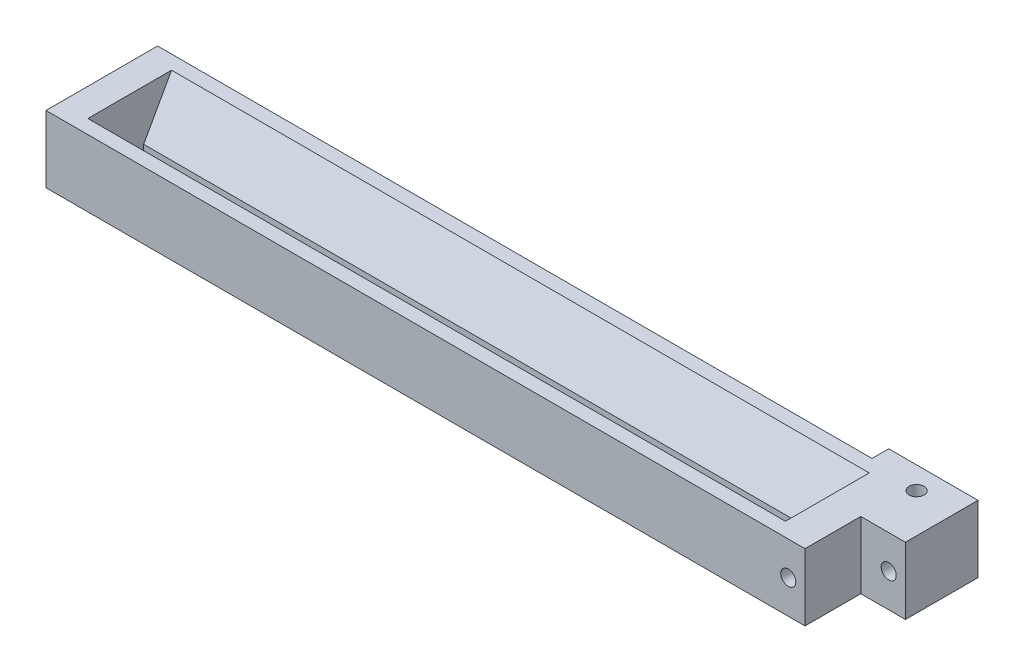
ISO-10303-21;
HEADER;
FILE_DESCRIPTION(('STEP AP214'),'2;1');
FILE_NAME('part.step','',(''),(''),'','','');
FILE_SCHEMA(('AUTOMOTIVE_DESIGN { 1 0 10303 214 1 1 1 1 }'));
ENDSEC;
DATA;
#1=APPLICATION_CONTEXT('core data for automotive mechanical design processes');
#2=APPLICATION_PROTOCOL_DEFINITION('international standard','automotive_design',2000,#1);
#3=PRODUCT_CONTEXT('',#1,'mechanical');
#4=PRODUCT('Part','Part','',(#3));
#5=PRODUCT_RELATED_PRODUCT_CATEGORY('part','',(#4));
#6=PRODUCT_DEFINITION_FORMATION('','',#4);
#7=PRODUCT_DEFINITION_CONTEXT('part definition',#1,'design');
#8=PRODUCT_DEFINITION('design','',#6,#7);
#9=PRODUCT_DEFINITION_SHAPE('','',#8);
#10=(LENGTH_UNIT() NAMED_UNIT(*) SI_UNIT(.MILLI.,.METRE.));
#11=(NAMED_UNIT(*) PLANE_ANGLE_UNIT() SI_UNIT($,.RADIAN.));
#12=(NAMED_UNIT(*) SI_UNIT($,.STERADIAN.) SOLID_ANGLE_UNIT());
#13=UNCERTAINTY_MEASURE_WITH_UNIT(LENGTH_MEASURE(1.E-05),#10,'distance_accuracy_value','');
#14=(GEOMETRIC_REPRESENTATION_CONTEXT(3) GLOBAL_UNCERTAINTY_ASSIGNED_CONTEXT((#13)) GLOBAL_UNIT_ASSIGNED_CONTEXT((#10,
#11,#12)) REPRESENTATION_CONTEXT('',''));
#15=CARTESIAN_POINT('',(0.,0.,0.));
#16=DIRECTION('',(0.,0.,1.));
#17=DIRECTION('',(1.,0.,0.));
#18=AXIS2_PLACEMENT_3D('',#15,#16,#17);
#19=CARTESIAN_POINT('',(0.,12.,0.));
#20=DIRECTION('',(0.,1.,0.));
#21=DIRECTION('',(0.,0.,1.));
#22=AXIS2_PLACEMENT_3D('',#19,#20,#21);
#23=PLANE('',#22);
#24=DIRECTION('',(1.,0.,0.));
#25=VECTOR('',#24,1.);
#26=CARTESIAN_POINT('',(-67.5,12.,10.));
#27=LINE('',#26,#25);
#28=CARTESIAN_POINT('',(-67.5,12.,10.));
#29=VERTEX_POINT('',#28);
#30=CARTESIAN_POINT('',(68.5,12.,10.));
#31=VERTEX_POINT('',#30);
#32=EDGE_CURVE('E137',#29,#31,#27,.T.);
#33=ORIENTED_EDGE('',*,*,#32,.T.);
#34=DIRECTION('',(0.,0.,-1.));
#35=VECTOR('',#34,1.);
#36=CARTESIAN_POINT('',(68.5,12.,10.));
#37=LINE('',#36,#35);
#38=CARTESIAN_POINT('',(68.5,12.,0.));
#39=VERTEX_POINT('',#38);
#40=EDGE_CURVE('E142',#31,#39,#37,.T.);
#41=ORIENTED_EDGE('',*,*,#40,.T.);
#42=DIRECTION('',(1.,0.,0.));
#43=VECTOR('',#42,1.);
#44=CARTESIAN_POINT('',(68.5,12.,0.));
#45=LINE('',#44,#43);
#46=CARTESIAN_POINT('',(76.5,12.,0.));
#47=VERTEX_POINT('',#46);
#48=EDGE_CURVE('E163',#39,#47,#45,.T.);
#49=ORIENTED_EDGE('',*,*,#48,.T.);
#50=DIRECTION('',(0.,0.,-1.));
#51=VECTOR('',#50,1.);
#52=CARTESIAN_POINT('',(76.5,12.,0.));
#53=LINE('',#52,#51);
#54=CARTESIAN_POINT('',(76.5,12.,-13.));
#55=VERTEX_POINT('',#54);
#56=EDGE_CURVE('E166',#47,#55,#53,.T.);
#57=ORIENTED_EDGE('',*,*,#56,.T.);
#58=DIRECTION('',(-1.,0.,0.));
#59=VECTOR('',#58,1.);
#60=CARTESIAN_POINT('',(60.5,12.,-13.));
#61=LINE('',#60,#59);
#62=CARTESIAN_POINT('',(60.5,12.,-13.));
#63=VERTEX_POINT('',#62);
#64=EDGE_CURVE('E175',#55,#63,#61,.T.);
#65=ORIENTED_EDGE('',*,*,#64,.T.);
#66=DIRECTION('',(0.,0.,1.));
#67=VECTOR('',#66,1.);
#68=CARTESIAN_POINT('',(60.5,12.,-10.));
#69=LINE('',#68,#67);
#70=CARTESIAN_POINT('',(60.5,12.,-10.));
#71=VERTEX_POINT('',#70);
#72=EDGE_CURVE('E164',#63,#71,#69,.T.);
#73=ORIENTED_EDGE('',*,*,#72,.T.);
#74=DIRECTION('',(-1.,0.,0.));
#75=VECTOR('',#74,1.);
#76=CARTESIAN_POINT('',(-67.5,12.,-10.));
#77=LINE('',#76,#75);
#78=CARTESIAN_POINT('',(-67.5,12.,-10.));
#79=VERTEX_POINT('',#78);
#80=EDGE_CURVE('E49',#71,#79,#77,.T.);
#81=ORIENTED_EDGE('',*,*,#80,.T.);
#82=DIRECTION('',(0.,0.,1.));
#83=VECTOR('',#82,1.);
#84=CARTESIAN_POINT('',(-67.5,12.,10.));
#85=LINE('',#84,#83);
#86=EDGE_CURVE('E144',#79,#29,#85,.T.);
#87=ORIENTED_EDGE('',*,*,#86,.T.);
#88=EDGE_LOOP('',(#33,#41,#49,#57,#65,#73,#81,#87));
#89=FACE_BOUND('',#88,.T.);
#90=DIRECTION('',(1.,0.,0.));
#91=VECTOR('',#90,1.);
#92=CARTESIAN_POINT('',(-62.5,12.,7.5));
#93=LINE('',#92,#91);
#94=CARTESIAN_POINT('',(-62.5,12.,7.5));
#95=VERTEX_POINT('',#94);
#96=CARTESIAN_POINT('',(62.5,12.,7.5));
#97=VERTEX_POINT('',#96);
#98=EDGE_CURVE('E211',#95,#97,#93,.T.);
#99=ORIENTED_EDGE('',*,*,#98,.F.);
#100=DIRECTION('',(0.,0.,1.));
#101=VECTOR('',#100,1.);
#102=CARTESIAN_POINT('',(-62.5,12.,-7.5));
#103=LINE('',#102,#101);
#104=CARTESIAN_POINT('',(-62.5,12.,-7.5));
#105=VERTEX_POINT('',#104);
#106=EDGE_CURVE('E192',#105,#95,#103,.T.);
#107=ORIENTED_EDGE('',*,*,#106,.F.);
#108=DIRECTION('',(1.,0.,0.));
#109=VECTOR('',#108,1.);
#110=CARTESIAN_POINT('',(-62.5,12.,-7.5));
#111=LINE('',#110,#109);
#112=CARTESIAN_POINT('',(62.5,12.,-7.5));
#113=VERTEX_POINT('',#112);
#114=EDGE_CURVE('E226',#105,#113,#111,.T.);
#115=ORIENTED_EDGE('',*,*,#114,.T.);
#116=DIRECTION('',(0.,0.,1.));
#117=VECTOR('',#116,1.);
#118=CARTESIAN_POINT('',(62.5,12.,-7.5));
#119=LINE('',#118,#117);
#120=EDGE_CURVE('E190',#113,#97,#119,.T.);
#121=ORIENTED_EDGE('',*,*,#120,.T.);
#122=EDGE_LOOP('',(#99,#107,#115,#121));
#123=FACE_BOUND('',#122,.T.);
#124=CARTESIAN_POINT('',(69.5,12.,-9.));
#125=DIRECTION('',(0.,1.,0.));
#126=DIRECTION('',(0.,0.,1.));
#127=AXIS2_PLACEMENT_3D('',#124,#125,#126);
#128=CIRCLE('',#127,1.35000000000001);
#129=CARTESIAN_POINT('',(69.5,12.,-7.65));
#130=VERTEX_POINT('',#129);
#131=EDGE_CURVE('E169',#130,#130,#128,.T.);
#132=ORIENTED_EDGE('',*,*,#131,.F.);
#133=EDGE_LOOP('',(#132));
#134=FACE_BOUND('',#133,.T.);
#135=ADVANCED_FACE('F34',(#89,#123,#134),#23,.T.);
#136=CARTESIAN_POINT('',(0.,0.,0.));
#137=DIRECTION('',(0.,1.,0.));
#138=DIRECTION('',(0.,0.,1.));
#139=AXIS2_PLACEMENT_3D('',#136,#137,#138);
#140=PLANE('',#139);
#141=DIRECTION('',(1.,0.,0.));
#142=VECTOR('',#141,1.);
#143=CARTESIAN_POINT('',(-67.5,0.,10.));
#144=LINE('',#143,#142);
#145=CARTESIAN_POINT('',(-67.5,0.,10.));
#146=VERTEX_POINT('',#145);
#147=CARTESIAN_POINT('',(68.5,0.,10.));
#148=VERTEX_POINT('',#147);
#149=EDGE_CURVE('E153',#146,#148,#144,.T.);
#150=ORIENTED_EDGE('',*,*,#149,.F.);
#151=DIRECTION('',(0.,0.,1.));
#152=VECTOR('',#151,1.);
#153=CARTESIAN_POINT('',(-67.5,0.,10.));
#154=LINE('',#153,#152);
#155=CARTESIAN_POINT('',(-67.5,0.,-10.));
#156=VERTEX_POINT('',#155);
#157=EDGE_CURVE('E148',#156,#146,#154,.T.);
#158=ORIENTED_EDGE('',*,*,#157,.F.);
#159=DIRECTION('',(-1.,0.,0.));
#160=VECTOR('',#159,1.);
#161=CARTESIAN_POINT('',(-67.5,0.,-10.));
#162=LINE('',#161,#160);
#163=CARTESIAN_POINT('',(60.5,0.,-10.));
#164=VERTEX_POINT('',#163);
#165=EDGE_CURVE('E243',#164,#156,#162,.T.);
#166=ORIENTED_EDGE('',*,*,#165,.F.);
#167=DIRECTION('',(0.,0.,-1.));
#168=VECTOR('',#167,1.);
#169=CARTESIAN_POINT('',(60.5,0.,-10.));
#170=LINE('',#169,#168);
#171=CARTESIAN_POINT('',(60.5,0.,-13.));
#172=VERTEX_POINT('',#171);
#173=EDGE_CURVE('E191',#164,#172,#170,.T.);
#174=ORIENTED_EDGE('',*,*,#173,.T.);
#175=DIRECTION('',(1.,0.,0.));
#176=VECTOR('',#175,1.);
#177=CARTESIAN_POINT('',(60.5,0.,-13.));
#178=LINE('',#177,#176);
#179=CARTESIAN_POINT('',(76.5,0.,-13.));
#180=VERTEX_POINT('',#179);
#181=EDGE_CURVE('E260',#172,#180,#178,.T.);
#182=ORIENTED_EDGE('',*,*,#181,.T.);
#183=DIRECTION('',(0.,0.,1.));
#184=VECTOR('',#183,1.);
#185=CARTESIAN_POINT('',(76.5,0.,0.));
#186=LINE('',#185,#184);
#187=CARTESIAN_POINT('',(76.5,0.,0.));
#188=VERTEX_POINT('',#187);
#189=EDGE_CURVE('E253',#180,#188,#186,.T.);
#190=ORIENTED_EDGE('',*,*,#189,.T.);
#191=DIRECTION('',(-1.,0.,0.));
#192=VECTOR('',#191,1.);
#193=CARTESIAN_POINT('',(68.5,0.,0.));
#194=LINE('',#193,#192);
#195=CARTESIAN_POINT('',(68.5,0.,0.));
#196=VERTEX_POINT('',#195);
#197=EDGE_CURVE('E251',#188,#196,#194,.T.);
#198=ORIENTED_EDGE('',*,*,#197,.T.);
#199=DIRECTION('',(0.,0.,1.));
#200=VECTOR('',#199,1.);
#201=CARTESIAN_POINT('',(68.5,0.,10.));
#202=LINE('',#201,#200);
#203=EDGE_CURVE('E180',#196,#148,#202,.T.);
#204=ORIENTED_EDGE('',*,*,#203,.T.);
#205=EDGE_LOOP('',(#150,#158,#166,#174,#182,#190,#198,#204));
#206=FACE_BOUND('',#205,.T.);
#207=DIRECTION('',(0.,0.,-1.));
#208=VECTOR('',#207,1.);
#209=CARTESIAN_POINT('',(-62.5,0.,2.5));
#210=LINE('',#209,#208);
#211=CARTESIAN_POINT('',(-62.5,0.,2.5));
#212=VERTEX_POINT('',#211);
#213=CARTESIAN_POINT('',(-62.5,0.,-2.5));
#214=VERTEX_POINT('',#213);
#215=EDGE_CURVE('E202',#212,#214,#210,.T.);
#216=ORIENTED_EDGE('',*,*,#215,.F.);
#217=DIRECTION('',(1.,0.,0.));
#218=VECTOR('',#217,1.);
#219=CARTESIAN_POINT('',(-62.5,0.,2.5));
#220=LINE('',#219,#218);
#221=CARTESIAN_POINT('',(62.5,0.,2.5));
#222=VERTEX_POINT('',#221);
#223=EDGE_CURVE('E234',#212,#222,#220,.T.);
#224=ORIENTED_EDGE('',*,*,#223,.T.);
#225=DIRECTION('',(0.,0.,-1.));
#226=VECTOR('',#225,1.);
#227=CARTESIAN_POINT('',(62.5,0.,2.5));
#228=LINE('',#227,#226);
#229=CARTESIAN_POINT('',(62.5,0.,-2.5));
#230=VERTEX_POINT('',#229);
#231=EDGE_CURVE('E218',#222,#230,#228,.T.);
#232=ORIENTED_EDGE('',*,*,#231,.T.);
#233=DIRECTION('',(1.,0.,0.));
#234=VECTOR('',#233,1.);
#235=CARTESIAN_POINT('',(-62.5,0.,-2.5));
#236=LINE('',#235,#234);
#237=EDGE_CURVE('E231',#214,#230,#236,.T.);
#238=ORIENTED_EDGE('',*,*,#237,.F.);
#239=EDGE_LOOP('',(#216,#224,#232,#238));
#240=FACE_BOUND('',#239,.T.);
#241=CARTESIAN_POINT('',(69.5,0.,-9.));
#242=DIRECTION('',(0.,1.,0.));
#243=DIRECTION('',(0.,0.,1.));
#244=AXIS2_PLACEMENT_3D('',#241,#242,#243);
#245=CIRCLE('',#244,1.35000000000001);
#246=CARTESIAN_POINT('',(69.5,0.,-7.65));
#247=VERTEX_POINT('',#246);
#248=EDGE_CURVE('E187',#247,#247,#245,.F.);
#249=ORIENTED_EDGE('',*,*,#248,.F.);
#250=EDGE_LOOP('',(#249));
#251=FACE_BOUND('',#250,.T.);
#252=ADVANCED_FACE('F248',(#206,#240,#251),#140,.F.);
#253=CARTESIAN_POINT('',(-67.5,12.,10.));
#254=DIRECTION('',(0.,0.,-1.));
#255=DIRECTION('',(-1.,0.,0.));
#256=AXIS2_PLACEMENT_3D('',#253,#254,#255);
#257=PLANE('',#256);
#258=CARTESIAN_POINT('',(65.5,6.,10.));
#259=DIRECTION('',(0.,0.,-1.));
#260=DIRECTION('',(-1.,0.,0.));
#261=AXIS2_PLACEMENT_3D('',#258,#259,#260);
#262=CIRCLE('',#261,1.35000000000001);
#263=CARTESIAN_POINT('',(64.15,6.,10.));
#264=VERTEX_POINT('',#263);
#265=EDGE_CURVE('E266',#264,#264,#262,.T.);
#266=ORIENTED_EDGE('',*,*,#265,.T.);
#267=EDGE_LOOP('',(#266));
#268=FACE_BOUND('',#267,.T.);
#269=ORIENTED_EDGE('',*,*,#149,.T.);
#270=DIRECTION('',(0.,1.,0.));
#271=VECTOR('',#270,1.);
#272=CARTESIAN_POINT('',(68.5,-28.0178514522438,10.));
#273=LINE('',#272,#271);
#274=EDGE_CURVE('E151',#148,#31,#273,.T.);
#275=ORIENTED_EDGE('',*,*,#274,.T.);
#276=ORIENTED_EDGE('',*,*,#32,.F.);
#277=DIRECTION('',(0.,-1.,0.));
#278=VECTOR('',#277,1.);
#279=CARTESIAN_POINT('',(-67.5,12.,10.));
#280=LINE('',#279,#278);
#281=EDGE_CURVE('E42',#29,#146,#280,.T.);
#282=ORIENTED_EDGE('',*,*,#281,.T.);
#283=EDGE_LOOP('',(#269,#275,#276,#282));
#284=FACE_BOUND('',#283,.T.);
#285=ADVANCED_FACE('F36',(#268,#284),#257,.F.);
#286=CARTESIAN_POINT('',(-67.5,12.,-10.));
#287=DIRECTION('',(0.,0.,1.));
#288=DIRECTION('',(1.,0.,0.));
#289=AXIS2_PLACEMENT_3D('',#286,#287,#288);
#290=PLANE('',#289);
#291=ORIENTED_EDGE('',*,*,#80,.F.);
#292=DIRECTION('',(0.,1.,0.));
#293=VECTOR('',#292,1.);
#294=CARTESIAN_POINT('',(60.5,-28.0178514522438,-10.));
#295=LINE('',#294,#293);
#296=EDGE_CURVE('E158',#164,#71,#295,.T.);
#297=ORIENTED_EDGE('',*,*,#296,.F.);
#298=ORIENTED_EDGE('',*,*,#165,.T.);
#299=DIRECTION('',(0.,-1.,0.));
#300=VECTOR('',#299,1.);
#301=CARTESIAN_POINT('',(-67.5,12.,-10.));
#302=LINE('',#301,#300);
#303=EDGE_CURVE('E11',#79,#156,#302,.T.);
#304=ORIENTED_EDGE('',*,*,#303,.F.);
#305=EDGE_LOOP('',(#291,#297,#298,#304));
#306=FACE_BOUND('',#305,.T.);
#307=ADVANCED_FACE('F325',(#306),#290,.F.);
#308=CARTESIAN_POINT('',(-67.5,12.,10.));
#309=DIRECTION('',(1.,0.,0.));
#310=DIRECTION('',(0.,0.,-1.));
#311=AXIS2_PLACEMENT_3D('',#308,#309,#310);
#312=PLANE('',#311);
#313=ORIENTED_EDGE('',*,*,#157,.T.);
#314=ORIENTED_EDGE('',*,*,#281,.F.);
#315=ORIENTED_EDGE('',*,*,#86,.F.);
#316=ORIENTED_EDGE('',*,*,#303,.T.);
#317=EDGE_LOOP('',(#313,#314,#315,#316));
#318=FACE_BOUND('',#317,.T.);
#319=ADVANCED_FACE('F322',(#318),#312,.F.);
#320=CARTESIAN_POINT('',(-62.5,12.,-7.5));
#321=DIRECTION('',(0.,-0.485642931178632,-0.874157276121538));
#322=DIRECTION('',(0.,0.874157276121538,-0.485642931178632));
#323=AXIS2_PLACEMENT_3D('',#320,#321,#322);
#324=PLANE('',#323);
#325=DIRECTION('',(0.,0.874157276121538,-0.485642931178632));
#326=VECTOR('',#325,1.);
#327=CARTESIAN_POINT('',(62.5,12.,-7.5));
#328=LINE('',#327,#326);
#329=CARTESIAN_POINT('',(62.5,3.,-2.5));
#330=VERTEX_POINT('',#329);
#331=EDGE_CURVE('E196',#330,#113,#328,.T.);
#332=ORIENTED_EDGE('',*,*,#331,.T.);
#333=ORIENTED_EDGE('',*,*,#114,.F.);
#334=DIRECTION('',(0.,0.874157276121538,-0.485642931178632));
#335=VECTOR('',#334,1.);
#336=CARTESIAN_POINT('',(-62.5,12.,-7.5));
#337=LINE('',#336,#335);
#338=CARTESIAN_POINT('',(-62.5,3.,-2.5));
#339=VERTEX_POINT('',#338);
#340=EDGE_CURVE('E208',#339,#105,#337,.T.);
#341=ORIENTED_EDGE('',*,*,#340,.F.);
#342=DIRECTION('',(1.,0.,0.));
#343=VECTOR('',#342,1.);
#344=CARTESIAN_POINT('',(-62.5,3.,-2.5));
#345=LINE('',#344,#343);
#346=EDGE_CURVE('E229',#339,#330,#345,.T.);
#347=ORIENTED_EDGE('',*,*,#346,.T.);
#348=EDGE_LOOP('',(#332,#333,#341,#347));
#349=FACE_BOUND('',#348,.T.);
#350=ADVANCED_FACE('F324',(#349),#324,.F.);
#351=CARTESIAN_POINT('',(-62.5,0.,-2.5));
#352=DIRECTION('',(0.,0.,-1.));
#353=DIRECTION('',(0.,1.,0.));
#354=AXIS2_PLACEMENT_3D('',#351,#352,#353);
#355=PLANE('',#354);
#356=DIRECTION('',(0.,1.,0.));
#357=VECTOR('',#356,1.);
#358=CARTESIAN_POINT('',(62.5,0.,-2.5));
#359=LINE('',#358,#357);
#360=EDGE_CURVE('E221',#230,#330,#359,.T.);
#361=ORIENTED_EDGE('',*,*,#360,.T.);
#362=ORIENTED_EDGE('',*,*,#346,.F.);
#363=DIRECTION('',(0.,1.,0.));
#364=VECTOR('',#363,1.);
#365=CARTESIAN_POINT('',(-62.5,0.,-2.5));
#366=LINE('',#365,#364);
#367=EDGE_CURVE('E205',#214,#339,#366,.T.);
#368=ORIENTED_EDGE('',*,*,#367,.F.);
#369=ORIENTED_EDGE('',*,*,#237,.T.);
#370=EDGE_LOOP('',(#361,#362,#368,#369));
#371=FACE_BOUND('',#370,.T.);
#372=ADVANCED_FACE('F421',(#371),#355,.F.);
#373=CARTESIAN_POINT('',(-62.5,3.,2.5));
#374=DIRECTION('',(0.,0.,1.));
#375=DIRECTION('',(0.,-1.,0.));
#376=AXIS2_PLACEMENT_3D('',#373,#374,#375);
#377=PLANE('',#376);
#378=DIRECTION('',(0.,-1.,0.));
#379=VECTOR('',#378,1.);
#380=CARTESIAN_POINT('',(62.5,3.,2.5));
#381=LINE('',#380,#379);
#382=CARTESIAN_POINT('',(62.5,3.,2.5));
#383=VERTEX_POINT('',#382);
#384=EDGE_CURVE('E215',#383,#222,#381,.T.);
#385=ORIENTED_EDGE('',*,*,#384,.T.);
#386=ORIENTED_EDGE('',*,*,#223,.F.);
#387=DIRECTION('',(0.,-1.,0.));
#388=VECTOR('',#387,1.);
#389=CARTESIAN_POINT('',(-62.5,3.,2.5));
#390=LINE('',#389,#388);
#391=CARTESIAN_POINT('',(-62.5,3.,2.5));
#392=VERTEX_POINT('',#391);
#393=EDGE_CURVE('E199',#392,#212,#390,.T.);
#394=ORIENTED_EDGE('',*,*,#393,.F.);
#395=DIRECTION('',(1.,0.,0.));
#396=VECTOR('',#395,1.);
#397=CARTESIAN_POINT('',(-62.5,3.,2.5));
#398=LINE('',#397,#396);
#399=EDGE_CURVE('E237',#392,#383,#398,.T.);
#400=ORIENTED_EDGE('',*,*,#399,.T.);
#401=EDGE_LOOP('',(#385,#386,#394,#400));
#402=FACE_BOUND('',#401,.T.);
#403=ADVANCED_FACE('F424',(#402),#377,.F.);
#404=CARTESIAN_POINT('',(-62.5,12.,7.5));
#405=DIRECTION('',(0.,-0.485642931178632,0.874157276121538));
#406=DIRECTION('',(0.,-0.874157276121538,-0.485642931178632));
#407=AXIS2_PLACEMENT_3D('',#404,#405,#406);
#408=PLANE('',#407);
#409=DIRECTION('',(0.,-0.874157276121538,-0.485642931178632));
#410=VECTOR('',#409,1.);
#411=CARTESIAN_POINT('',(62.5,12.,7.5));
#412=LINE('',#411,#410);
#413=EDGE_CURVE('E57',#97,#383,#412,.T.);
#414=ORIENTED_EDGE('',*,*,#413,.T.);
#415=ORIENTED_EDGE('',*,*,#399,.F.);
#416=DIRECTION('',(0.,-0.874157276121538,-0.485642931178632));
#417=VECTOR('',#416,1.);
#418=CARTESIAN_POINT('',(-62.5,12.,7.5));
#419=LINE('',#418,#417);
#420=EDGE_CURVE('E195',#95,#392,#419,.T.);
#421=ORIENTED_EDGE('',*,*,#420,.F.);
#422=ORIENTED_EDGE('',*,*,#98,.T.);
#423=EDGE_LOOP('',(#414,#415,#421,#422));
#424=FACE_BOUND('',#423,.T.);
#425=ADVANCED_FACE('F319',(#424),#408,.F.);
#426=CARTESIAN_POINT('',(-62.5,0.,0.));
#427=DIRECTION('',(1.,0.,0.));
#428=DIRECTION('',(0.,0.,-1.));
#429=AXIS2_PLACEMENT_3D('',#426,#427,#428);
#430=PLANE('',#429);
#431=ORIENTED_EDGE('',*,*,#106,.T.);
#432=ORIENTED_EDGE('',*,*,#420,.T.);
#433=ORIENTED_EDGE('',*,*,#393,.T.);
#434=ORIENTED_EDGE('',*,*,#215,.T.);
#435=ORIENTED_EDGE('',*,*,#367,.T.);
#436=ORIENTED_EDGE('',*,*,#340,.T.);
#437=EDGE_LOOP('',(#431,#432,#433,#434,#435,#436));
#438=FACE_BOUND('',#437,.T.);
#439=ADVANCED_FACE('F414',(#438),#430,.T.);
#440=CARTESIAN_POINT('',(62.5,0.,0.));
#441=DIRECTION('',(1.,0.,0.));
#442=DIRECTION('',(0.,0.,-1.));
#443=AXIS2_PLACEMENT_3D('',#440,#441,#442);
#444=PLANE('',#443);
#445=ORIENTED_EDGE('',*,*,#120,.F.);
#446=ORIENTED_EDGE('',*,*,#331,.F.);
#447=ORIENTED_EDGE('',*,*,#360,.F.);
#448=ORIENTED_EDGE('',*,*,#231,.F.);
#449=ORIENTED_EDGE('',*,*,#384,.F.);
#450=ORIENTED_EDGE('',*,*,#413,.F.);
#451=EDGE_LOOP('',(#445,#446,#447,#448,#449,#450));
#452=FACE_BOUND('',#451,.T.);
#453=ADVANCED_FACE('F310',(#452),#444,.F.);
#454=CARTESIAN_POINT('',(68.5,-28.0178514522438,10.));
#455=DIRECTION('',(1.,0.,0.));
#456=DIRECTION('',(0.,0.,-1.));
#457=AXIS2_PLACEMENT_3D('',#454,#455,#456);
#458=PLANE('',#457);
#459=ORIENTED_EDGE('',*,*,#203,.F.);
#460=DIRECTION('',(0.,1.,0.));
#461=VECTOR('',#460,1.);
#462=CARTESIAN_POINT('',(68.5,-28.0178514522438,0.));
#463=LINE('',#462,#461);
#464=EDGE_CURVE('E157',#196,#39,#463,.T.);
#465=ORIENTED_EDGE('',*,*,#464,.T.);
#466=ORIENTED_EDGE('',*,*,#40,.F.);
#467=ORIENTED_EDGE('',*,*,#274,.F.);
#468=EDGE_LOOP('',(#459,#465,#466,#467));
#469=FACE_BOUND('',#468,.T.);
#470=ADVANCED_FACE('F160',(#469),#458,.T.);
#471=CARTESIAN_POINT('',(68.5,-28.0178514522438,0.));
#472=DIRECTION('',(0.,0.,1.));
#473=DIRECTION('',(1.,0.,0.));
#474=AXIS2_PLACEMENT_3D('',#471,#472,#473);
#475=PLANE('',#474);
#476=CARTESIAN_POINT('',(73.5,6.,0.));
#477=DIRECTION('',(0.,0.,1.));
#478=DIRECTION('',(1.,0.,0.));
#479=AXIS2_PLACEMENT_3D('',#476,#477,#478);
#480=CIRCLE('',#479,1.35000000000001);
#481=CARTESIAN_POINT('',(74.85,6.,0.));
#482=VERTEX_POINT('',#481);
#483=EDGE_CURVE('E256',#482,#482,#480,.T.);
#484=ORIENTED_EDGE('',*,*,#483,.F.);
#485=EDGE_LOOP('',(#484));
#486=FACE_BOUND('',#485,.T.);
#487=ORIENTED_EDGE('',*,*,#197,.F.);
#488=DIRECTION('',(0.,1.,0.));
#489=VECTOR('',#488,1.);
#490=CARTESIAN_POINT('',(76.5,-28.0178514522438,0.));
#491=LINE('',#490,#489);
#492=EDGE_CURVE('E183',#188,#47,#491,.T.);
#493=ORIENTED_EDGE('',*,*,#492,.T.);
#494=ORIENTED_EDGE('',*,*,#48,.F.);
#495=ORIENTED_EDGE('',*,*,#464,.F.);
#496=EDGE_LOOP('',(#487,#493,#494,#495));
#497=FACE_BOUND('',#496,.T.);
#498=ADVANCED_FACE('F301',(#486,#497),#475,.T.);
#499=CARTESIAN_POINT('',(76.5,-28.0178514522438,0.));
#500=DIRECTION('',(1.,0.,0.));
#501=DIRECTION('',(0.,0.,-1.));
#502=AXIS2_PLACEMENT_3D('',#499,#500,#501);
#503=PLANE('',#502);
#504=ORIENTED_EDGE('',*,*,#189,.F.);
#505=DIRECTION('',(0.,1.,0.));
#506=VECTOR('',#505,1.);
#507=CARTESIAN_POINT('',(76.5,-28.0178514522438,-13.));
#508=LINE('',#507,#506);
#509=EDGE_CURVE('E181',#180,#55,#508,.T.);
#510=ORIENTED_EDGE('',*,*,#509,.T.);
#511=ORIENTED_EDGE('',*,*,#56,.F.);
#512=ORIENTED_EDGE('',*,*,#492,.F.);
#513=EDGE_LOOP('',(#504,#510,#511,#512));
#514=FACE_BOUND('',#513,.T.);
#515=ADVANCED_FACE('F286',(#514),#503,.T.);
#516=CARTESIAN_POINT('',(60.5,-28.0178514522438,-13.));
#517=DIRECTION('',(0.,0.,-1.));
#518=DIRECTION('',(-1.,0.,0.));
#519=AXIS2_PLACEMENT_3D('',#516,#517,#518);
#520=PLANE('',#519);
#521=CARTESIAN_POINT('',(65.5,6.,-13.));
#522=DIRECTION('',(0.,0.,-1.));
#523=DIRECTION('',(-1.,0.,0.));
#524=AXIS2_PLACEMENT_3D('',#521,#522,#523);
#525=CIRCLE('',#524,1.35000000000001);
#526=CARTESIAN_POINT('',(64.15,6.,-13.));
#527=VERTEX_POINT('',#526);
#528=EDGE_CURVE('E270',#527,#527,#525,.T.);
#529=ORIENTED_EDGE('',*,*,#528,.F.);
#530=EDGE_LOOP('',(#529));
#531=FACE_BOUND('',#530,.T.);
#532=CARTESIAN_POINT('',(73.5,6.,-13.));
#533=DIRECTION('',(0.,0.,-1.));
#534=DIRECTION('',(-1.,0.,0.));
#535=AXIS2_PLACEMENT_3D('',#532,#533,#534);
#536=CIRCLE('',#535,1.35000000000001);
#537=CARTESIAN_POINT('',(72.15,6.,-13.));
#538=VERTEX_POINT('',#537);
#539=EDGE_CURVE('E275',#538,#538,#536,.T.);
#540=ORIENTED_EDGE('',*,*,#539,.F.);
#541=EDGE_LOOP('',(#540));
#542=FACE_BOUND('',#541,.T.);
#543=ORIENTED_EDGE('',*,*,#181,.F.);
#544=DIRECTION('',(0.,1.,0.));
#545=VECTOR('',#544,1.);
#546=CARTESIAN_POINT('',(60.5,-28.0178514522438,-13.));
#547=LINE('',#546,#545);
#548=EDGE_CURVE('E178',#172,#63,#547,.T.);
#549=ORIENTED_EDGE('',*,*,#548,.T.);
#550=ORIENTED_EDGE('',*,*,#64,.F.);
#551=ORIENTED_EDGE('',*,*,#509,.F.);
#552=EDGE_LOOP('',(#543,#549,#550,#551));
#553=FACE_BOUND('',#552,.T.);
#554=ADVANCED_FACE('F282',(#531,#542,#553),#520,.T.);
#555=CARTESIAN_POINT('',(60.5,-28.0178514522438,-10.));
#556=DIRECTION('',(-1.,0.,0.));
#557=DIRECTION('',(0.,0.,1.));
#558=AXIS2_PLACEMENT_3D('',#555,#556,#557);
#559=PLANE('',#558);
#560=ORIENTED_EDGE('',*,*,#173,.F.);
#561=ORIENTED_EDGE('',*,*,#296,.T.);
#562=ORIENTED_EDGE('',*,*,#72,.F.);
#563=ORIENTED_EDGE('',*,*,#548,.F.);
#564=EDGE_LOOP('',(#560,#561,#562,#563));
#565=FACE_BOUND('',#564,.T.);
#566=ADVANCED_FACE('F285',(#565),#559,.T.);
#567=CARTESIAN_POINT('',(69.5,-28.0178514522438,-9.));
#568=DIRECTION('',(0.,1.,0.));
#569=DIRECTION('',(0.,0.,1.));
#570=AXIS2_PLACEMENT_3D('',#567,#568,#569);
#571=CYLINDRICAL_SURFACE('',#570,1.35000000000001);
#572=ORIENTED_EDGE('',*,*,#248,.T.);
#573=EDGE_LOOP('',(#572));
#574=FACE_BOUND('',#573,.T.);
#575=ORIENTED_EDGE('',*,*,#131,.T.);
#576=EDGE_LOOP('',(#575));
#577=FACE_BOUND('',#576,.T.);
#578=ADVANCED_FACE('F370',(#574,#577),#571,.F.);
#579=CARTESIAN_POINT('',(73.5,6.,10.));
#580=DIRECTION('',(0.,0.,-1.));
#581=DIRECTION('',(-1.,0.,0.));
#582=AXIS2_PLACEMENT_3D('',#579,#580,#581);
#583=CYLINDRICAL_SURFACE('',#582,1.35000000000001);
#584=ORIENTED_EDGE('',*,*,#483,.T.);
#585=EDGE_LOOP('',(#584));
#586=FACE_BOUND('',#585,.T.);
#587=ORIENTED_EDGE('',*,*,#539,.T.);
#588=EDGE_LOOP('',(#587));
#589=FACE_BOUND('',#588,.T.);
#590=ADVANCED_FACE('F280',(#586,#589),#583,.F.);
#591=CARTESIAN_POINT('',(65.5,6.,10.));
#592=DIRECTION('',(0.,0.,-1.));
#593=DIRECTION('',(-1.,0.,0.));
#594=AXIS2_PLACEMENT_3D('',#591,#592,#593);
#595=CYLINDRICAL_SURFACE('',#594,1.35000000000001);
#596=ORIENTED_EDGE('',*,*,#265,.F.);
#597=EDGE_LOOP('',(#596));
#598=FACE_BOUND('',#597,.T.);
#599=ORIENTED_EDGE('',*,*,#528,.T.);
#600=EDGE_LOOP('',(#599));
#601=FACE_BOUND('',#600,.T.);
#602=ADVANCED_FACE('F388',(#598,#601),#595,.F.);
#603=CLOSED_SHELL('',(#135,#252,#285,#307,#319,#350,#372,#403,#425,#439,#453,#470,#498,#515,
#554,#566,#578,#590,#602));
#604=MANIFOLD_SOLID_BREP('B2',#603);
#605=ADVANCED_BREP_SHAPE_REPRESENTATION('',(#18,#604),#14);
#606=SHAPE_DEFINITION_REPRESENTATION(#9,#605);
ENDSEC;
END-ISO-10303-21;
